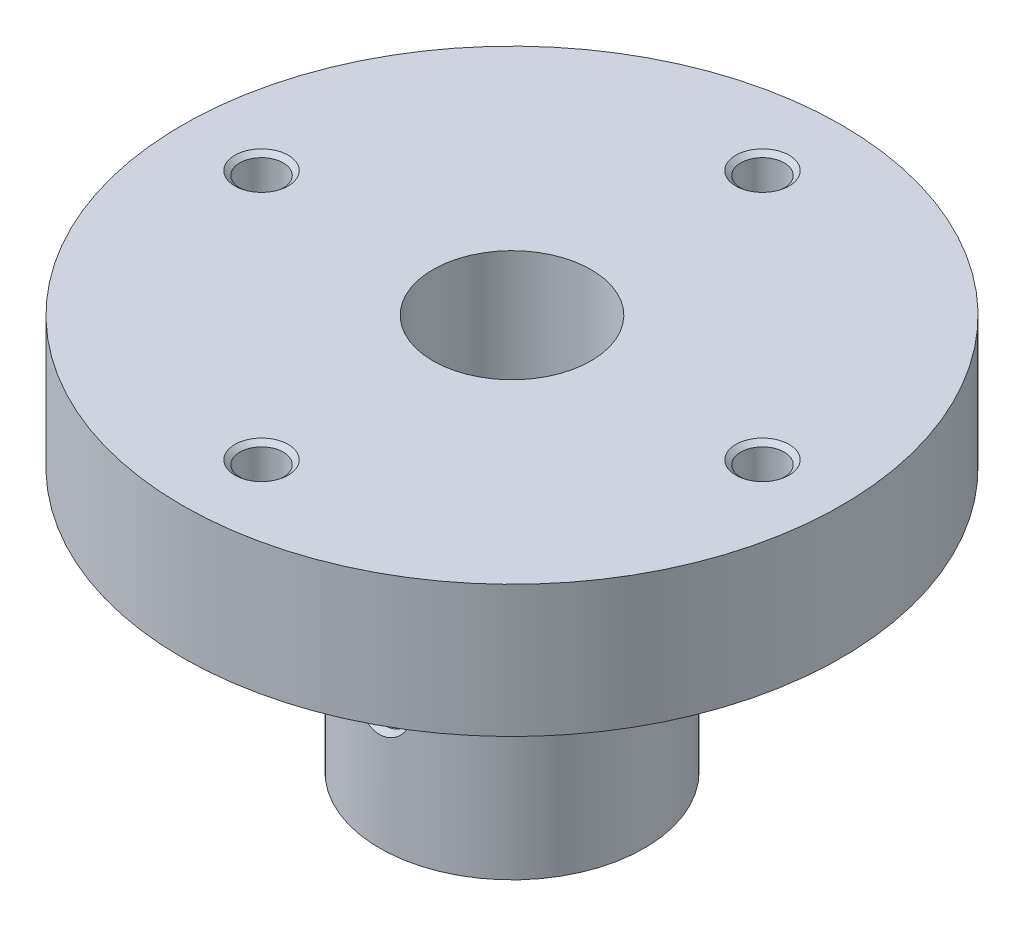
ISO-10303-21;
HEADER;
FILE_DESCRIPTION(('STEP AP214'),'2;1');
FILE_NAME('part.step','',(''),(''),'','','');
FILE_SCHEMA(('AUTOMOTIVE_DESIGN { 1 0 10303 214 1 1 1 1 }'));
ENDSEC;
DATA;
#1=APPLICATION_CONTEXT('core data for automotive mechanical design processes');
#2=APPLICATION_PROTOCOL_DEFINITION('international standard','automotive_design',2000,#1);
#3=PRODUCT_CONTEXT('',#1,'mechanical');
#4=PRODUCT('Part','Part','',(#3));
#5=PRODUCT_RELATED_PRODUCT_CATEGORY('part','',(#4));
#6=PRODUCT_DEFINITION_FORMATION('','',#4);
#7=PRODUCT_DEFINITION_CONTEXT('part definition',#1,'design');
#8=PRODUCT_DEFINITION('design','',#6,#7);
#9=PRODUCT_DEFINITION_SHAPE('','',#8);
#10=(LENGTH_UNIT() NAMED_UNIT(*) SI_UNIT(.MILLI.,.METRE.));
#11=(NAMED_UNIT(*) PLANE_ANGLE_UNIT() SI_UNIT($,.RADIAN.));
#12=(NAMED_UNIT(*) SI_UNIT($,.STERADIAN.) SOLID_ANGLE_UNIT());
#13=UNCERTAINTY_MEASURE_WITH_UNIT(LENGTH_MEASURE(1.E-05),#10,'distance_accuracy_value','');
#14=(GEOMETRIC_REPRESENTATION_CONTEXT(3) GLOBAL_UNCERTAINTY_ASSIGNED_CONTEXT((#13)) GLOBAL_UNIT_ASSIGNED_CONTEXT((#10,
#11,#12)) REPRESENTATION_CONTEXT('',''));
#15=CARTESIAN_POINT('',(0.,0.,0.));
#16=DIRECTION('',(0.,0.,1.));
#17=DIRECTION('',(1.,0.,0.));
#18=AXIS2_PLACEMENT_3D('',#15,#16,#17);
#19=CARTESIAN_POINT('',(0.,10.,0.));
#20=DIRECTION('',(0.,-1.,0.));
#21=DIRECTION('',(0.,0.,-1.));
#22=AXIS2_PLACEMENT_3D('',#19,#20,#21);
#23=CYLINDRICAL_SURFACE('',#22,25.);
#24=CARTESIAN_POINT('',(0.,10.,0.));
#25=DIRECTION('',(0.,1.,0.));
#26=DIRECTION('',(0.,0.,1.));
#27=AXIS2_PLACEMENT_3D('',#24,#25,#26);
#28=CIRCLE('',#27,25.);
#29=CARTESIAN_POINT('',(0.,10.,25.));
#30=VERTEX_POINT('',#29);
#31=EDGE_CURVE('E127',#30,#30,#28,.T.);
#32=ORIENTED_EDGE('',*,*,#31,.F.);
#33=EDGE_LOOP('',(#32));
#34=FACE_BOUND('',#33,.T.);
#35=CARTESIAN_POINT('',(0.,0.,0.));
#36=DIRECTION('',(0.,1.,0.));
#37=DIRECTION('',(0.,0.,1.));
#38=AXIS2_PLACEMENT_3D('',#35,#36,#37);
#39=CIRCLE('',#38,25.);
#40=CARTESIAN_POINT('',(0.,0.,25.));
#41=VERTEX_POINT('',#40);
#42=EDGE_CURVE('E123',#41,#41,#39,.T.);
#43=ORIENTED_EDGE('',*,*,#42,.T.);
#44=EDGE_LOOP('',(#43));
#45=FACE_BOUND('',#44,.T.);
#46=ADVANCED_FACE('F44',(#34,#45),#23,.T.);
#47=CARTESIAN_POINT('',(0.,10.,0.));
#48=DIRECTION('',(0.,1.,0.));
#49=DIRECTION('',(0.,0.,1.));
#50=AXIS2_PLACEMENT_3D('',#47,#48,#49);
#51=PLANE('',#50);
#52=CARTESIAN_POINT('',(1.99014436314059E-13,10.,-19.));
#53=DIRECTION('',(0.,1.,0.));
#54=DIRECTION('',(0.,0.,1.));
#55=AXIS2_PLACEMENT_3D('',#52,#53,#54);
#56=CIRCLE('',#55,2.025);
#57=CARTESIAN_POINT('',(1.99014436314059E-13,10.,-16.975));
#58=VERTEX_POINT('',#57);
#59=EDGE_CURVE('E87',#58,#58,#56,.T.);
#60=ORIENTED_EDGE('',*,*,#59,.F.);
#61=EDGE_LOOP('',(#60));
#62=FACE_BOUND('',#61,.T.);
#63=CARTESIAN_POINT('',(-19.,10.,0.));
#64=DIRECTION('',(0.,1.,0.));
#65=DIRECTION('',(0.,0.,1.));
#66=AXIS2_PLACEMENT_3D('',#63,#64,#65);
#67=CIRCLE('',#66,2.025);
#68=CARTESIAN_POINT('',(-19.,10.,2.025));
#69=VERTEX_POINT('',#68);
#70=EDGE_CURVE('E77',#69,#69,#67,.T.);
#71=ORIENTED_EDGE('',*,*,#70,.F.);
#72=EDGE_LOOP('',(#71));
#73=FACE_BOUND('',#72,.T.);
#74=CARTESIAN_POINT('',(0.,10.,19.));
#75=DIRECTION('',(0.,1.,0.));
#76=DIRECTION('',(0.,0.,1.));
#77=AXIS2_PLACEMENT_3D('',#74,#75,#76);
#78=CIRCLE('',#77,2.025);
#79=CARTESIAN_POINT('',(0.,10.,21.025));
#80=VERTEX_POINT('',#79);
#81=EDGE_CURVE('E96',#80,#80,#78,.T.);
#82=ORIENTED_EDGE('',*,*,#81,.F.);
#83=EDGE_LOOP('',(#82));
#84=FACE_BOUND('',#83,.T.);
#85=CARTESIAN_POINT('',(19.,10.,0.));
#86=DIRECTION('',(0.,1.,0.));
#87=DIRECTION('',(0.,0.,1.));
#88=AXIS2_PLACEMENT_3D('',#85,#86,#87);
#89=CIRCLE('',#88,2.025);
#90=CARTESIAN_POINT('',(19.,10.,2.025));
#91=VERTEX_POINT('',#90);
#92=EDGE_CURVE('E104',#91,#91,#89,.T.);
#93=ORIENTED_EDGE('',*,*,#92,.F.);
#94=EDGE_LOOP('',(#93));
#95=FACE_BOUND('',#94,.T.);
#96=CARTESIAN_POINT('',(0.,10.,0.));
#97=DIRECTION('',(0.,1.,0.));
#98=DIRECTION('',(0.,0.,1.));
#99=AXIS2_PLACEMENT_3D('',#96,#97,#98);
#100=CIRCLE('',#99,6.);
#101=CARTESIAN_POINT('',(0.,10.,6.));
#102=VERTEX_POINT('',#101);
#103=EDGE_CURVE('E111',#102,#102,#100,.T.);
#104=ORIENTED_EDGE('',*,*,#103,.F.);
#105=EDGE_LOOP('',(#104));
#106=FACE_BOUND('',#105,.T.);
#107=ORIENTED_EDGE('',*,*,#31,.T.);
#108=EDGE_LOOP('',(#107));
#109=FACE_BOUND('',#108,.T.);
#110=ADVANCED_FACE('F194',(#62,#73,#84,#95,#106,#109),#51,.T.);
#111=CARTESIAN_POINT('',(0.,0.,0.));
#112=DIRECTION('',(0.,1.,0.));
#113=DIRECTION('',(0.,0.,1.));
#114=AXIS2_PLACEMENT_3D('',#111,#112,#113);
#115=PLANE('',#114);
#116=CARTESIAN_POINT('',(0.,0.,0.));
#117=DIRECTION('',(0.,-1.,0.));
#118=DIRECTION('',(0.,0.,-1.));
#119=AXIS2_PLACEMENT_3D('',#116,#117,#118);
#120=CIRCLE('',#119,10.0372343927899);
#121=CARTESIAN_POINT('',(0.,0.,-10.0372343927899));
#122=VERTEX_POINT('',#121);
#123=EDGE_CURVE('E60',#122,#122,#120,.T.);
#124=ORIENTED_EDGE('',*,*,#123,.F.);
#125=EDGE_LOOP('',(#124));
#126=FACE_BOUND('',#125,.T.);
#127=ORIENTED_EDGE('',*,*,#42,.F.);
#128=EDGE_LOOP('',(#127));
#129=FACE_BOUND('',#128,.T.);
#130=ADVANCED_FACE('F203',(#126,#129),#115,.F.);
#131=CARTESIAN_POINT('',(0.,-20.,0.));
#132=DIRECTION('',(0.,1.,0.));
#133=DIRECTION('',(0.,0.,1.));
#134=AXIS2_PLACEMENT_3D('',#131,#132,#133);
#135=CYLINDRICAL_SURFACE('',#134,10.0372343927899);
#136=CARTESIAN_POINT('',(-1.64356990396883,-11.6985312908338,9.9017550082425));
#137=CARTESIAN_POINT('',(-1.73422947818861,-11.5858426197323,9.88670771021838));
#138=CARTESIAN_POINT('',(-1.81506054808089,-11.4650334925082,9.87201762151097));
#139=CARTESIAN_POINT('',(-1.95580454643881,-11.2113734056327,9.84510371110789));
#140=CARTESIAN_POINT('',(-2.01567431469845,-11.0784983014401,9.83288499966162));
#141=CARTESIAN_POINT('',(-2.11387483461546,-10.803866218912,9.81224470232854));
#142=CARTESIAN_POINT('',(-2.15207949455347,-10.6620624760162,9.80384540047349));
#143=CARTESIAN_POINT('',(-2.20588470825511,-10.3741181502912,9.79187977197743));
#144=CARTESIAN_POINT('',(-2.22149462187069,-10.2279793888563,9.78831144414972));
#145=CARTESIAN_POINT('',(-2.23014551722098,-9.92747922377839,9.78634560382281));
#146=CARTESIAN_POINT('',(-2.22198938294154,-9.77308010082029,9.78822234384879));
#147=CARTESIAN_POINT('',(-2.18060688235606,-9.46779987108379,9.79752357504465));
#148=CARTESIAN_POINT('',(-2.1473727233386,-9.31691987286019,9.80494979064411));
#149=CARTESIAN_POINT('',(-2.05613430673416,-9.02247533490889,9.82448794057037));
#150=CARTESIAN_POINT('',(-1.99803258572763,-8.87894209397449,9.83661829406322));
#151=CARTESIAN_POINT('',(-1.85784729136947,-8.60434258733911,9.86405396339339));
#152=CARTESIAN_POINT('',(-1.77576192355411,-8.47327725546389,9.87935951677527));
#153=CARTESIAN_POINT('',(-1.59249202114886,-8.23326462288303,9.91051610503394));
#154=CARTESIAN_POINT('',(-1.49216618526002,-8.1236592414593,9.92632333621496));
#155=CARTESIAN_POINT('',(-1.2723662589714,-7.92544506965164,9.95687704759709));
#156=CARTESIAN_POINT('',(-1.1529094447073,-7.83681751260757,9.97162446761089));
#157=CARTESIAN_POINT('',(-0.912106667799033,-7.69408921196699,9.99635508824647));
#158=CARTESIAN_POINT('',(-0.792419768113685,-7.63725980892378,10.006684222805));
#159=CARTESIAN_POINT('',(-0.544062057512413,-7.54786338483615,10.0232462216751));
#160=CARTESIAN_POINT('',(-0.415403092686255,-7.51526501023326,10.0294843782415));
#161=CARTESIAN_POINT('',(-0.171895496902527,-7.47927157372739,10.0363991827265));
#162=CARTESIAN_POINT('',(-0.057555867781271,-7.47250059102782,10.0377181850133));
#163=CARTESIAN_POINT('',(0.17049735379137,-7.47914124567622,10.0364328868645));
#164=CARTESIAN_POINT('',(0.284211128089924,-7.492546671974,10.0338297937956));
#165=CARTESIAN_POINT('',(0.501134977468274,-7.53742936421518,10.0252719901169));
#166=CARTESIAN_POINT('',(0.604575996691329,-7.56784689288423,10.0195141896545));
#167=CARTESIAN_POINT('',(0.805215029882228,-7.64447274987198,10.0053899621802));
#168=CARTESIAN_POINT('',(0.902412050028048,-7.69068358456074,9.99702312113671));
#169=CARTESIAN_POINT('',(1.09395913368746,-7.80007188922011,9.97793192372423));
#170=CARTESIAN_POINT('',(1.18782856612482,-7.86406846560833,9.96710011530356));
#171=CARTESIAN_POINT('',(1.3648748201171,-8.00526965530058,9.94440415886167));
#172=CARTESIAN_POINT('',(1.44804700766485,-8.08247995921383,9.9325395671494));
#173=CARTESIAN_POINT('',(1.61208643898895,-8.25794300308402,9.9073186372548));
#174=CARTESIAN_POINT('',(1.69143572164107,-8.35761360711438,9.89395682553107));
#175=CARTESIAN_POINT('',(1.83439983761348,-8.56779530719191,9.86845144474268));
#176=CARTESIAN_POINT('',(1.89800690653382,-8.67831171524543,9.85630847858711));
#177=CARTESIAN_POINT('',(2.01541575320076,-8.92113732675701,9.83301526775001));
#178=CARTESIAN_POINT('',(2.06715342247651,-9.05447547387192,9.82215457478999));
#179=CARTESIAN_POINT('',(2.14945191891908,-9.32779016277167,9.80447367415475));
#180=CARTESIAN_POINT('',(2.18000589526876,-9.46776883648404,9.79765477370062));
#181=CARTESIAN_POINT('',(2.22085390674637,-9.7603534099585,9.78848150928827));
#182=CARTESIAN_POINT('',(2.22966216234889,-9.91317916561038,9.78645493744686));
#183=CARTESIAN_POINT('',(2.22258235656572,-10.2182409650138,9.78806461714411));
#184=CARTESIAN_POINT('',(2.20669017212133,-10.3704769060595,9.79170181409329));
#185=CARTESIAN_POINT('',(2.1499807092978,-10.6726040469778,9.80431094424909));
#186=CARTESIAN_POINT('',(2.10876166889715,-10.8224166681892,9.81336880432589));
#187=CARTESIAN_POINT('',(2.00163670312704,-11.112670011174,9.8357767812871));
#188=CARTESIAN_POINT('',(1.93572656111928,-11.2531091273521,9.84912763125433));
#189=CARTESIAN_POINT('',(1.78177645251061,-11.5171905961388,9.87812437245986));
#190=CARTESIAN_POINT('',(1.69421911330795,-11.6411188257604,9.89371745958495));
#191=CARTESIAN_POINT('',(1.49769461369742,-11.8706892265944,9.9253638466547));
#192=CARTESIAN_POINT('',(1.3887370621081,-11.9763395647884,9.94141693730224));
#193=CARTESIAN_POINT('',(1.16183361907888,-12.1560454547734,9.97036330936557));
#194=CARTESIAN_POINT('',(1.04543618927282,-12.2320218675158,9.98340914750186));
#195=CARTESIAN_POINT('',(0.79977177009487,-12.3598229004577,10.0060757110936));
#196=CARTESIAN_POINT('',(0.670523204808717,-12.4116815081479,10.0157012519841));
#197=CARTESIAN_POINT('',(0.422423439587833,-12.4823253083828,10.0290013394127));
#198=CARTESIAN_POINT('',(0.304626984818807,-12.5047077658261,10.0333174537469));
#199=CARTESIAN_POINT('',(0.0668711820512237,-12.5275011463435,10.0377135659183));
#200=CARTESIAN_POINT('',(-0.0530866743194175,-12.5279266820485,10.0377963810735));
#201=CARTESIAN_POINT('',(-0.279798471529067,-12.507808532396,10.0339150504052));
#202=CARTESIAN_POINT('',(-0.386739497494312,-12.489218981267,10.0303280372868));
#203=CARTESIAN_POINT('',(-0.596049653516701,-12.4349768031591,10.0200690288792));
#204=CARTESIAN_POINT('',(-0.698417621667803,-12.3993198664165,10.0133962544046));
#205=CARTESIAN_POINT('',(-0.898266378393643,-12.311659418402,9.99747335576874));
#206=CARTESIAN_POINT('',(-0.995594973464975,-12.2593212579515,9.98817095251989));
#207=CARTESIAN_POINT('',(-1.18103724957513,-12.1406888797095,9.96794513226743));
#208=CARTESIAN_POINT('',(-1.26915614252521,-12.0744026200696,9.95702264065686));
#209=CARTESIAN_POINT('',(-1.40503910904268,-11.9560897158055,9.93855165301148));
#210=CARTESIAN_POINT('',(-1.4559046080807,-11.9075291471661,9.93120525943665));
#211=CARTESIAN_POINT('',(-1.55314337389194,-11.8061283954212,9.91646279682187));
#212=CARTESIAN_POINT('',(-1.59951696452395,-11.7532885213512,9.90906673140435));
#213=CARTESIAN_POINT('',(-1.64356990396883,-11.6985312908338,9.9017550082425));
#214=B_SPLINE_CURVE_WITH_KNOTS('',3,(#136,#137,#138,#139,#140,#141,#142,#143,#144,#145,#146,
#147,#148,#149,#150,#151,#152,#153,#154,#155,#156,#157,#158,#159,#160,#161,#162,#163,#164,#165,
#166,#167,#168,#169,#170,#171,#172,#173,#174,#175,#176,#177,#178,#179,#180,#181,#182,#183,#184,
#185,#186,#187,#188,#189,#190,#191,#192,#193,#194,#195,#196,#197,#198,#199,#200,#201,#202,#203,
#204,#205,#206,#207,#208,#209,#210,#211,#212,#213),.UNSPECIFIED.,.T.,.F.,(4,2,2,2,2,2,2,2,2,2,2,
2,2,2,2,2,2,2,2,2,2,2,2,2,2,2,2,2,2,2,2,2,2,2,2,2,2,2,4),(0.,0.435970196492093,
0.872832866476009,1.31221266430329,1.7514103973298,2.21310716193595,2.67494745267887,
3.13861465211215,3.60231655215379,4.048134747005,4.49355259481126,4.88988238916287,
5.28569845853457,5.62754313615863,5.96928260277963,6.29178559901106,6.61433979968802,
6.95533883569362,7.29648509722302,7.67923343384034,8.06217017566694,8.49062323951149,
8.91921480074494,9.3763671788314,9.8335958741225,10.2982718780177,10.7630272734499,
11.218231468657,11.6732317398936,12.0896027453344,12.5053851976368,12.863328850068,
13.2210342830406,13.5453416525577,13.8697309576502,14.2010876310217,14.5322557574827,
14.7441159461716,14.9559608487219),.UNSPECIFIED.);
#215=CARTESIAN_POINT('',(-1.64356990396883,-11.6985312908338,9.9017550082425));
#216=VERTEX_POINT('',#215);
#217=EDGE_CURVE('E11',#216,#216,#214,.T.);
#218=ORIENTED_EDGE('',*,*,#217,.T.);
#219=EDGE_LOOP('',(#218));
#220=FACE_BOUND('',#219,.T.);
#221=CARTESIAN_POINT('',(0.,-20.,0.));
#222=DIRECTION('',(0.,-1.,0.));
#223=DIRECTION('',(0.,0.,-1.));
#224=AXIS2_PLACEMENT_3D('',#221,#222,#223);
#225=CIRCLE('',#224,10.0372343927899);
#226=CARTESIAN_POINT('',(0.,-20.,-10.0372343927899));
#227=VERTEX_POINT('',#226);
#228=EDGE_CURVE('E120',#227,#227,#225,.T.);
#229=ORIENTED_EDGE('',*,*,#228,.F.);
#230=EDGE_LOOP('',(#229));
#231=FACE_BOUND('',#230,.T.);
#232=ORIENTED_EDGE('',*,*,#123,.T.);
#233=EDGE_LOOP('',(#232));
#234=FACE_BOUND('',#233,.T.);
#235=ADVANCED_FACE('F208',(#220,#231,#234),#135,.T.);
#236=CARTESIAN_POINT('',(0.,-20.,0.));
#237=DIRECTION('',(0.,-1.,0.));
#238=DIRECTION('',(0.,0.,-1.));
#239=AXIS2_PLACEMENT_3D('',#236,#237,#238);
#240=PLANE('',#239);
#241=CARTESIAN_POINT('',(0.,-20.,0.));
#242=DIRECTION('',(0.,1.,0.));
#243=DIRECTION('',(0.,0.,1.));
#244=AXIS2_PLACEMENT_3D('',#241,#242,#243);
#245=CIRCLE('',#244,6.);
#246=CARTESIAN_POINT('',(0.,-20.,6.));
#247=VERTEX_POINT('',#246);
#248=EDGE_CURVE('E113',#247,#247,#245,.T.);
#249=ORIENTED_EDGE('',*,*,#248,.T.);
#250=EDGE_LOOP('',(#249));
#251=FACE_BOUND('',#250,.T.);
#252=ORIENTED_EDGE('',*,*,#228,.T.);
#253=EDGE_LOOP('',(#252));
#254=FACE_BOUND('',#253,.T.);
#255=ADVANCED_FACE('F191',(#251,#254),#240,.T.);
#256=CARTESIAN_POINT('',(0.,-20.,0.));
#257=DIRECTION('',(0.,1.,0.));
#258=DIRECTION('',(0.,0.,1.));
#259=AXIS2_PLACEMENT_3D('',#256,#257,#258);
#260=CYLINDRICAL_SURFACE('',#259,6.);
#261=CARTESIAN_POINT('',(0.,-12.1,6.));
#262=CARTESIAN_POINT('',(0.114251619400622,-12.1000017739896,6.00000124479722));
#263=CARTESIAN_POINT('',(0.228490572963444,-12.0906461971568,5.99670718672287));
#264=CARTESIAN_POINT('',(0.453584015501345,-12.0535997241027,5.98389272550116));
#265=CARTESIAN_POINT('',(0.564438489369619,-12.0259087460529,5.97437229456631));
#266=CARTESIAN_POINT('',(0.779485413609654,-11.9532706368988,5.95013476153419));
#267=CARTESIAN_POINT('',(0.883689296254851,-11.9083541021366,5.93542687718391));
#268=CARTESIAN_POINT('',(1.0830819871769,-11.8026849332416,5.9023013983887));
#269=CARTESIAN_POINT('',(1.17826873947788,-11.741928699326,5.88388296088765));
#270=CARTESIAN_POINT('',(1.36051553523195,-11.6039028906096,5.8444837041619));
#271=CARTESIAN_POINT('',(1.44718917885624,-11.5261420490665,5.82343705066232));
#272=CARTESIAN_POINT('',(1.60656711090756,-11.3573579986316,5.78150036966384));
#273=CARTESIAN_POINT('',(1.67926788523806,-11.2663314635877,5.76061038283181));
#274=CARTESIAN_POINT('',(1.81093773861651,-11.0700072102648,5.72061212527967));
#275=CARTESIAN_POINT('',(1.86938779836972,-10.9643436649245,5.70158313672155));
#276=CARTESIAN_POINT('',(1.96751959370708,-10.7439132458253,5.66847146607346));
#277=CARTESIAN_POINT('',(2.00720773271171,-10.6291494935943,5.65438709681397));
#278=CARTESIAN_POINT('',(2.0652098359655,-10.398194180391,5.63345661812697));
#279=CARTESIAN_POINT('',(2.08425340292729,-10.2822088617183,5.62636429642411));
#280=CARTESIAN_POINT('',(2.10270718664323,-10.0484889286481,5.61949543126126));
#281=CARTESIAN_POINT('',(2.10212422592437,-9.93075493634554,5.61971634559107));
#282=CARTESIAN_POINT('',(2.08190459940416,-9.70327032467044,5.6272345610432));
#283=CARTESIAN_POINT('',(2.06324229061491,-9.59341901183151,5.63416998262607));
#284=CARTESIAN_POINT('',(2.008991449874,-9.37851855622537,5.65374002730544));
#285=CARTESIAN_POINT('',(1.97340069468363,-9.27347004620447,5.66637539897383));
#286=CARTESIAN_POINT('',(1.88570622655403,-9.06903257993277,5.69616366426815));
#287=CARTESIAN_POINT('',(1.83332799267826,-8.96977266919094,5.71339079553398));
#288=CARTESIAN_POINT('',(1.71373613101811,-8.78115283060907,5.750392877314));
#289=CARTESIAN_POINT('',(1.64651787673616,-8.69179600321363,5.77016862157703));
#290=CARTESIAN_POINT('',(1.49456039711175,-8.52007406297834,5.81143944787469));
#291=CARTESIAN_POINT('',(1.4090316470524,-8.43841405027077,5.83296775946525));
#292=CARTESIAN_POINT('',(1.22523410835336,-8.29040207686654,5.87432244482545));
#293=CARTESIAN_POINT('',(1.12696383630198,-8.22405190109764,5.8941486199791));
#294=CARTESIAN_POINT('',(0.918860837471087,-8.10789640524754,5.93017388019725));
#295=CARTESIAN_POINT('',(0.808904282046241,-8.05829766253291,5.94632692796734));
#296=CARTESIAN_POINT('',(0.581505085784569,-7.9785266158801,5.9728492941218));
#297=CARTESIAN_POINT('',(0.46406534330214,-7.94834684033704,5.98322083678151));
#298=CARTESIAN_POINT('',(0.230989226208849,-7.90956051194694,5.99663436097715));
#299=CARTESIAN_POINT('',(0.115529579176201,-7.90000251608865,5.99999933499256));
#300=CARTESIAN_POINT('',(-0.115377891863058,-7.89999748639475,6.00000066417894));
#301=CARTESIAN_POINT('',(-0.23082571398975,-7.90954684685785,5.99663828885113));
#302=CARTESIAN_POINT('',(-0.454507376828143,-7.94674320994219,5.98377619392239));
#303=CARTESIAN_POINT('',(-0.562853716439329,-7.97379108264015,5.97447978494587));
#304=CARTESIAN_POINT('',(-0.773415026506118,-8.04445228894033,5.95088754065551));
#305=CARTESIAN_POINT('',(-0.875629201619193,-8.08806776600755,5.93659105846679));
#306=CARTESIAN_POINT('',(-1.0741840767636,-8.19195405317888,5.90394255172608));
#307=CARTESIAN_POINT('',(-1.17028394476469,-8.25265239082212,5.88548924058916));
#308=CARTESIAN_POINT('',(-1.35123467255019,-8.38848710774388,5.84660110480211));
#309=CARTESIAN_POINT('',(-1.43608178143559,-8.46362828093435,5.82616562334246));
#310=CARTESIAN_POINT('',(-1.59657189228235,-8.63068012096844,5.78430503834524));
#311=CARTESIAN_POINT('',(-1.67153670697074,-8.7232444647861,5.76288189348748));
#312=CARTESIAN_POINT('',(-1.80497245575436,-8.9200875396399,5.72249507214417));
#313=CARTESIAN_POINT('',(-1.86344281114401,-9.02436668150853,5.70353148196433));
#314=CARTESIAN_POINT('',(-1.96206588887549,-9.2420003741245,5.67036332969683));
#315=CARTESIAN_POINT('',(-2.00221823839335,-9.35535510953101,5.65615886447257));
#316=CARTESIAN_POINT('',(-2.0626509971247,-9.58783927233181,5.63440525238851));
#317=CARTESIAN_POINT('',(-2.08294160282034,-9.70696570369192,5.62685269082108));
#318=CARTESIAN_POINT('',(-2.10223163577423,-9.94037219292531,5.61967236621944));
#319=CARTESIAN_POINT('',(-2.10236838468444,-10.0545461780112,5.61962128080686));
#320=CARTESIAN_POINT('',(-2.08419060013712,-10.2811975738946,5.62638796100477));
#321=CARTESIAN_POINT('',(-2.06587739236712,-10.3936751059981,5.63320523310212));
#322=CARTESIAN_POINT('',(-2.01215791883086,-10.6111305752457,5.65261016405341));
#323=CARTESIAN_POINT('',(-1.97715663433253,-10.7162217800083,5.66506076725229));
#324=CARTESIAN_POINT('',(-1.89139271747185,-10.9191148568841,5.69426693797299));
#325=CARTESIAN_POINT('',(-1.84062637606361,-11.0169150069089,5.71102351840213));
#326=CARTESIAN_POINT('',(-1.72198212419163,-11.2074607452354,5.74793925414685));
#327=CARTESIAN_POINT('',(-1.65340944434223,-11.2997496401209,5.76822170996007));
#328=CARTESIAN_POINT('',(-1.50223440680439,-11.4718765772101,5.80942536879986));
#329=CARTESIAN_POINT('',(-1.41962789186428,-11.5517109165112,5.83034675958784));
#330=CARTESIAN_POINT('',(-1.23831189902208,-11.7002702690284,5.87159201716309));
#331=CARTESIAN_POINT('',(-1.13904838717694,-11.7683406703057,5.89184757341827));
#332=CARTESIAN_POINT('',(-0.929800577449995,-11.8867740971678,5.92846815702942));
#333=CARTESIAN_POINT('',(-0.819817701917968,-11.9371394679542,5.94483369956207));
#334=CARTESIAN_POINT('',(-0.59341790263596,-12.0179543314247,5.97165768609899));
#335=CARTESIAN_POINT('',(-0.477083727751902,-12.0486139651421,5.98217829048397));
#336=CARTESIAN_POINT('',(-0.2404940949632,-12.0896322910031,5.99634758229624));
#337=CARTESIAN_POINT('',(-0.120240033294066,-12.099998133028,5.99999868995766));
#338=CARTESIAN_POINT('',(0.,-12.1,6.));
#339=B_SPLINE_CURVE_WITH_KNOTS('',3,(#261,#262,#263,#264,#265,#266,#267,#268,#269,#270,#271,
#272,#273,#274,#275,#276,#277,#278,#279,#280,#281,#282,#283,#284,#285,#286,#287,#288,#289,#290,
#291,#292,#293,#294,#295,#296,#297,#298,#299,#300,#301,#302,#303,#304,#305,#306,#307,#308,#309,
#310,#311,#312,#313,#314,#315,#316,#317,#318,#319,#320,#321,#322,#323,#324,#325,#326,#327,#328,
#329,#330,#331,#332,#333,#334,#335,#336,#337,#338),.UNSPECIFIED.,.T.,.F.,(4,2,2,2,2,2,2,2,2,2,2,
2,2,2,2,2,2,2,2,2,2,2,2,2,2,2,2,2,2,2,2,2,2,2,2,2,2,2,4),(0.,0.342311966418851,
0.684625460541926,1.02633372652921,1.36811971807276,1.72152774061768,2.07502452728512,
2.43993230688261,2.80471545382672,3.15613820349785,3.50743879368812,3.8408028032104,
4.17421060603091,4.51337542799158,4.85264613704544,5.21157468826313,5.57054506475926,
5.93379308543942,6.2969012597962,6.6428625325812,6.98875852603917,7.3233968226191,
7.65807842841234,8.00202226625166,8.34608046478829,8.70745545379962,9.06884312002097,
9.43023814118972,9.79144753447261,10.1322648947517,10.4730577679759,10.8059714961508,
11.1389636083741,11.4876784253319,11.8364967229958,12.2008786824211,12.565212357747,
12.925593343809,13.2858473380639),.UNSPECIFIED.);
#340=CARTESIAN_POINT('',(0.,-12.1,6.));
#341=VERTEX_POINT('',#340);
#342=EDGE_CURVE('E128',#341,#341,#339,.T.);
#343=ORIENTED_EDGE('',*,*,#342,.T.);
#344=EDGE_LOOP('',(#343));
#345=FACE_BOUND('',#344,.T.);
#346=ORIENTED_EDGE('',*,*,#248,.F.);
#347=EDGE_LOOP('',(#346));
#348=FACE_BOUND('',#347,.T.);
#349=ORIENTED_EDGE('',*,*,#103,.T.);
#350=EDGE_LOOP('',(#349));
#351=FACE_BOUND('',#350,.T.);
#352=ADVANCED_FACE('F138',(#345,#348,#351),#260,.F.);
#353=CARTESIAN_POINT('',(19.,0.999999999999999,0.));
#354=DIRECTION('',(0.,1.,0.));
#355=DIRECTION('',(0.,0.,1.));
#356=AXIS2_PLACEMENT_3D('',#353,#354,#355);
#357=CONICAL_SURFACE('',#356,1.65,1.02974425867665);
#358=CARTESIAN_POINT('',(19.,0.00857997860452542,0.));
#359=VERTEX_POINT('',#358);
#360=VERTEX_LOOP('',#359);
#361=FACE_BOUND('',#360,.T.);
#362=CARTESIAN_POINT('',(19.,0.999999999999999,0.));
#363=DIRECTION('',(0.,1.,0.));
#364=DIRECTION('',(0.,0.,1.));
#365=AXIS2_PLACEMENT_3D('',#362,#363,#364);
#366=CIRCLE('',#365,1.65);
#367=CARTESIAN_POINT('',(19.,0.999999999999999,1.65));
#368=VERTEX_POINT('',#367);
#369=EDGE_CURVE('E112',#368,#368,#366,.T.);
#370=ORIENTED_EDGE('',*,*,#369,.T.);
#371=EDGE_LOOP('',(#370));
#372=FACE_BOUND('',#371,.T.);
#373=ADVANCED_FACE('F181',(#361,#372),#357,.F.);
#374=CARTESIAN_POINT('',(19.,10.,0.));
#375=DIRECTION('',(0.,1.,0.));
#376=DIRECTION('',(0.,0.,1.));
#377=AXIS2_PLACEMENT_3D('',#374,#375,#376);
#378=CYLINDRICAL_SURFACE('',#377,1.64999999999998);
#379=ORIENTED_EDGE('',*,*,#369,.F.);
#380=EDGE_LOOP('',(#379));
#381=FACE_BOUND('',#380,.T.);
#382=CARTESIAN_POINT('',(19.,9.68533763830852,0.));
#383=DIRECTION('',(0.,1.,0.));
#384=DIRECTION('',(0.,0.,1.));
#385=AXIS2_PLACEMENT_3D('',#382,#383,#384);
#386=CIRCLE('',#385,1.64999999999997);
#387=CARTESIAN_POINT('',(19.,9.68533763830852,1.64999999999997));
#388=VERTEX_POINT('',#387);
#389=EDGE_CURVE('E107',#388,#388,#386,.T.);
#390=ORIENTED_EDGE('',*,*,#389,.T.);
#391=EDGE_LOOP('',(#390));
#392=FACE_BOUND('',#391,.T.);
#393=ADVANCED_FACE('F179',(#381,#392),#378,.F.);
#394=CARTESIAN_POINT('',(19.,10.,0.));
#395=DIRECTION('',(0.,1.,0.));
#396=DIRECTION('',(0.,0.,1.));
#397=AXIS2_PLACEMENT_3D('',#394,#395,#396);
#398=CONICAL_SURFACE('',#397,2.025,0.872664625997204);
#399=ORIENTED_EDGE('',*,*,#389,.F.);
#400=EDGE_LOOP('',(#399));
#401=FACE_BOUND('',#400,.T.);
#402=ORIENTED_EDGE('',*,*,#92,.T.);
#403=EDGE_LOOP('',(#402));
#404=FACE_BOUND('',#403,.T.);
#405=ADVANCED_FACE('F180',(#401,#404),#398,.F.);
#406=CARTESIAN_POINT('',(0.,0.999999999999999,19.));
#407=DIRECTION('',(0.,1.,0.));
#408=DIRECTION('',(0.,0.,1.));
#409=AXIS2_PLACEMENT_3D('',#406,#407,#408);
#410=CONICAL_SURFACE('',#409,1.65,1.02974425867665);
#411=CARTESIAN_POINT('',(0.,0.00857997860452542,19.));
#412=VERTEX_POINT('',#411);
#413=VERTEX_LOOP('',#412);
#414=FACE_BOUND('',#413,.T.);
#415=CARTESIAN_POINT('',(0.,0.999999999999999,19.));
#416=DIRECTION('',(0.,1.,0.));
#417=DIRECTION('',(0.,0.,1.));
#418=AXIS2_PLACEMENT_3D('',#415,#416,#417);
#419=CIRCLE('',#418,1.65);
#420=CARTESIAN_POINT('',(0.,0.999999999999999,20.65));
#421=VERTEX_POINT('',#420);
#422=EDGE_CURVE('E105',#421,#421,#419,.T.);
#423=ORIENTED_EDGE('',*,*,#422,.T.);
#424=EDGE_LOOP('',(#423));
#425=FACE_BOUND('',#424,.T.);
#426=ADVANCED_FACE('F175',(#414,#425),#410,.F.);
#427=CARTESIAN_POINT('',(0.,10.,19.));
#428=DIRECTION('',(0.,1.,0.));
#429=DIRECTION('',(0.,0.,1.));
#430=AXIS2_PLACEMENT_3D('',#427,#428,#429);
#431=CYLINDRICAL_SURFACE('',#430,1.64999999999999);
#432=ORIENTED_EDGE('',*,*,#422,.F.);
#433=EDGE_LOOP('',(#432));
#434=FACE_BOUND('',#433,.T.);
#435=CARTESIAN_POINT('',(0.,9.68533763830852,19.));
#436=DIRECTION('',(0.,1.,0.));
#437=DIRECTION('',(0.,0.,1.));
#438=AXIS2_PLACEMENT_3D('',#435,#436,#437);
#439=CIRCLE('',#438,1.64999999999997);
#440=CARTESIAN_POINT('',(0.,9.68533763830852,20.65));
#441=VERTEX_POINT('',#440);
#442=EDGE_CURVE('E97',#441,#441,#439,.T.);
#443=ORIENTED_EDGE('',*,*,#442,.T.);
#444=EDGE_LOOP('',(#443));
#445=FACE_BOUND('',#444,.T.);
#446=ADVANCED_FACE('F166',(#434,#445),#431,.F.);
#447=CARTESIAN_POINT('',(0.,10.,19.));
#448=DIRECTION('',(0.,1.,0.));
#449=DIRECTION('',(0.,0.,1.));
#450=AXIS2_PLACEMENT_3D('',#447,#448,#449);
#451=CONICAL_SURFACE('',#450,2.025,0.872664625997205);
#452=ORIENTED_EDGE('',*,*,#442,.F.);
#453=EDGE_LOOP('',(#452));
#454=FACE_BOUND('',#453,.T.);
#455=ORIENTED_EDGE('',*,*,#81,.T.);
#456=EDGE_LOOP('',(#455));
#457=FACE_BOUND('',#456,.T.);
#458=ADVANCED_FACE('F164',(#454,#457),#451,.F.);
#459=CARTESIAN_POINT('',(-19.,0.999999999999999,0.));
#460=DIRECTION('',(0.,1.,0.));
#461=DIRECTION('',(0.,0.,1.));
#462=AXIS2_PLACEMENT_3D('',#459,#460,#461);
#463=CONICAL_SURFACE('',#462,1.65,1.02974425867665);
#464=CARTESIAN_POINT('',(-19.,0.00857997860452542,0.));
#465=VERTEX_POINT('',#464);
#466=VERTEX_LOOP('',#465);
#467=FACE_BOUND('',#466,.T.);
#468=CARTESIAN_POINT('',(-19.,0.999999999999999,0.));
#469=DIRECTION('',(0.,1.,0.));
#470=DIRECTION('',(0.,0.,1.));
#471=AXIS2_PLACEMENT_3D('',#468,#469,#470);
#472=CIRCLE('',#471,1.65);
#473=CARTESIAN_POINT('',(-19.,0.999999999999999,1.65));
#474=VERTEX_POINT('',#473);
#475=EDGE_CURVE('E91',#474,#474,#472,.T.);
#476=ORIENTED_EDGE('',*,*,#475,.T.);
#477=EDGE_LOOP('',(#476));
#478=FACE_BOUND('',#477,.T.);
#479=ADVANCED_FACE('F161',(#467,#478),#463,.F.);
#480=CARTESIAN_POINT('',(-19.,10.,0.));
#481=DIRECTION('',(0.,1.,0.));
#482=DIRECTION('',(0.,0.,1.));
#483=AXIS2_PLACEMENT_3D('',#480,#481,#482);
#484=CYLINDRICAL_SURFACE('',#483,1.64999999999998);
#485=ORIENTED_EDGE('',*,*,#475,.F.);
#486=EDGE_LOOP('',(#485));
#487=FACE_BOUND('',#486,.T.);
#488=CARTESIAN_POINT('',(-19.,9.68533763830852,0.));
#489=DIRECTION('',(0.,1.,0.));
#490=DIRECTION('',(0.,0.,1.));
#491=AXIS2_PLACEMENT_3D('',#488,#489,#490);
#492=CIRCLE('',#491,1.64999999999997);
#493=CARTESIAN_POINT('',(-19.,9.68533763830852,1.64999999999997));
#494=VERTEX_POINT('',#493);
#495=EDGE_CURVE('E82',#494,#494,#492,.T.);
#496=ORIENTED_EDGE('',*,*,#495,.T.);
#497=EDGE_LOOP('',(#496));
#498=FACE_BOUND('',#497,.T.);
#499=ADVANCED_FACE('F160',(#487,#498),#484,.F.);
#500=CARTESIAN_POINT('',(-19.,10.,0.));
#501=DIRECTION('',(0.,1.,0.));
#502=DIRECTION('',(0.,0.,1.));
#503=AXIS2_PLACEMENT_3D('',#500,#501,#502);
#504=CONICAL_SURFACE('',#503,2.025,0.872664625997204);
#505=ORIENTED_EDGE('',*,*,#495,.F.);
#506=EDGE_LOOP('',(#505));
#507=FACE_BOUND('',#506,.T.);
#508=ORIENTED_EDGE('',*,*,#70,.T.);
#509=EDGE_LOOP('',(#508));
#510=FACE_BOUND('',#509,.T.);
#511=ADVANCED_FACE('F74',(#507,#510),#504,.F.);
#512=CARTESIAN_POINT('',(1.99014436314059E-13,0.999999999999999,-19.));
#513=DIRECTION('',(0.,1.,0.));
#514=DIRECTION('',(0.,0.,1.));
#515=AXIS2_PLACEMENT_3D('',#512,#513,#514);
#516=CONICAL_SURFACE('',#515,1.65,1.02974425867665);
#517=CARTESIAN_POINT('',(1.96567244204431E-13,0.00857997860452542,-19.));
#518=VERTEX_POINT('',#517);
#519=VERTEX_LOOP('',#518);
#520=FACE_BOUND('',#519,.T.);
#521=CARTESIAN_POINT('',(1.99014436314059E-13,0.999999999999999,-19.));
#522=DIRECTION('',(0.,1.,0.));
#523=DIRECTION('',(0.,0.,1.));
#524=AXIS2_PLACEMENT_3D('',#521,#522,#523);
#525=CIRCLE('',#524,1.65);
#526=CARTESIAN_POINT('',(1.99014436314059E-13,0.999999999999999,-17.35));
#527=VERTEX_POINT('',#526);
#528=EDGE_CURVE('E80',#527,#527,#525,.T.);
#529=ORIENTED_EDGE('',*,*,#528,.T.);
#530=EDGE_LOOP('',(#529));
#531=FACE_BOUND('',#530,.T.);
#532=ADVANCED_FACE('F69',(#520,#531),#516,.F.);
#533=CARTESIAN_POINT('',(1.99014436314059E-13,10.,-19.));
#534=DIRECTION('',(0.,1.,0.));
#535=DIRECTION('',(0.,0.,1.));
#536=AXIS2_PLACEMENT_3D('',#533,#534,#535);
#537=CYLINDRICAL_SURFACE('',#536,1.64999999999999);
#538=ORIENTED_EDGE('',*,*,#528,.F.);
#539=EDGE_LOOP('',(#538));
#540=FACE_BOUND('',#539,.T.);
#541=CARTESIAN_POINT('',(1.99014436314059E-13,9.68533763830852,-19.));
#542=DIRECTION('',(0.,1.,0.));
#543=DIRECTION('',(0.,0.,1.));
#544=AXIS2_PLACEMENT_3D('',#541,#542,#543);
#545=CIRCLE('',#544,1.64999999999997);
#546=CARTESIAN_POINT('',(1.99014436314059E-13,9.68533763830852,-17.35));
#547=VERTEX_POINT('',#546);
#548=EDGE_CURVE('E81',#547,#547,#545,.T.);
#549=ORIENTED_EDGE('',*,*,#548,.T.);
#550=EDGE_LOOP('',(#549));
#551=FACE_BOUND('',#550,.T.);
#552=ADVANCED_FACE('F71',(#540,#551),#537,.F.);
#553=CARTESIAN_POINT('',(1.99014436314059E-13,10.,-19.));
#554=DIRECTION('',(0.,1.,0.));
#555=DIRECTION('',(0.,0.,1.));
#556=AXIS2_PLACEMENT_3D('',#553,#554,#555);
#557=CONICAL_SURFACE('',#556,2.025,0.872664625997205);
#558=ORIENTED_EDGE('',*,*,#548,.F.);
#559=EDGE_LOOP('',(#558));
#560=FACE_BOUND('',#559,.T.);
#561=ORIENTED_EDGE('',*,*,#59,.T.);
#562=EDGE_LOOP('',(#561));
#563=FACE_BOUND('',#562,.T.);
#564=ADVANCED_FACE('F149',(#560,#563),#557,.F.);
#565=CARTESIAN_POINT('',(0.,-10.,10.0372343927899));
#566=DIRECTION('',(0.,0.,1.));
#567=DIRECTION('',(1.,0.,0.));
#568=AXIS2_PLACEMENT_3D('',#565,#566,#567);
#569=CONICAL_SURFACE('',#568,2.525,0.872664625997165);
#570=CARTESIAN_POINT('',(0.,-10.,9.68061704953954));
#571=DIRECTION('',(0.,0.,1.));
#572=DIRECTION('',(1.,0.,0.));
#573=AXIS2_PLACEMENT_3D('',#570,#571,#572);
#574=CIRCLE('',#573,2.1);
#575=CARTESIAN_POINT('',(2.1,-10.,9.68061704953954));
#576=VERTEX_POINT('',#575);
#577=EDGE_CURVE('E140',#576,#576,#574,.T.);
#578=ORIENTED_EDGE('',*,*,#577,.F.);
#579=EDGE_LOOP('',(#578));
#580=FACE_BOUND('',#579,.T.);
#581=ORIENTED_EDGE('',*,*,#217,.F.);
#582=EDGE_LOOP('',(#581));
#583=FACE_BOUND('',#582,.T.);
#584=ADVANCED_FACE('F148',(#580,#583),#569,.F.);
#585=CARTESIAN_POINT('',(0.,-10.,10.0372343927899));
#586=DIRECTION('',(0.,0.,1.));
#587=DIRECTION('',(1.,0.,0.));
#588=AXIS2_PLACEMENT_3D('',#585,#586,#587);
#589=CYLINDRICAL_SURFACE('',#588,2.1);
#590=ORIENTED_EDGE('',*,*,#577,.T.);
#591=EDGE_LOOP('',(#590));
#592=FACE_BOUND('',#591,.T.);
#593=ORIENTED_EDGE('',*,*,#342,.F.);
#594=EDGE_LOOP('',(#593));
#595=FACE_BOUND('',#594,.T.);
#596=ADVANCED_FACE('F142',(#592,#595),#589,.F.);
#597=CLOSED_SHELL('',(#46,#110,#130,#235,#255,#352,#373,#393,#405,#426,#446,#458,#479,#499,#511,
#532,#552,#564,#584,#596));
#598=MANIFOLD_SOLID_BREP('B2',#597);
#599=ADVANCED_BREP_SHAPE_REPRESENTATION('',(#18,#598),#14);
#600=SHAPE_DEFINITION_REPRESENTATION(#9,#599);
ENDSEC;
END-ISO-10303-21;
